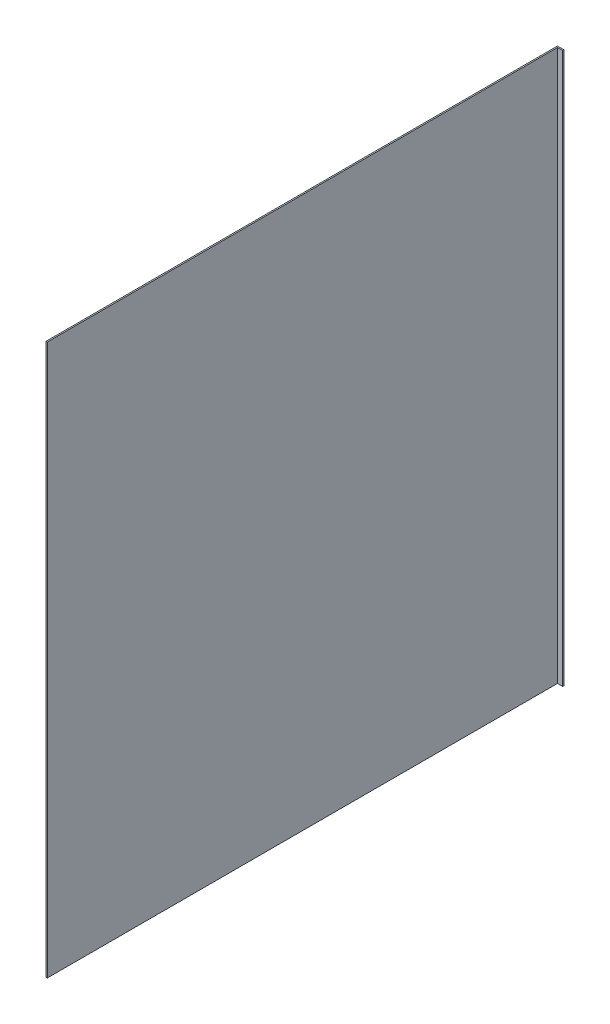
ISO-10303-21;
HEADER;
FILE_DESCRIPTION(('STEP AP214'),'2;1');
FILE_NAME('part.step','',(''),(''),'','','');
FILE_SCHEMA(('AUTOMOTIVE_DESIGN { 1 0 10303 214 1 1 1 1 }'));
ENDSEC;
DATA;
#1=APPLICATION_CONTEXT('core data for automotive mechanical design processes');
#2=APPLICATION_PROTOCOL_DEFINITION('international standard','automotive_design',2000,#1);
#3=PRODUCT_CONTEXT('',#1,'mechanical');
#4=PRODUCT('Part','Part','',(#3));
#5=PRODUCT_RELATED_PRODUCT_CATEGORY('part','',(#4));
#6=PRODUCT_DEFINITION_FORMATION('','',#4);
#7=PRODUCT_DEFINITION_CONTEXT('part definition',#1,'design');
#8=PRODUCT_DEFINITION('design','',#6,#7);
#9=PRODUCT_DEFINITION_SHAPE('','',#8);
#10=(LENGTH_UNIT() NAMED_UNIT(*) SI_UNIT(.MILLI.,.METRE.));
#11=(NAMED_UNIT(*) PLANE_ANGLE_UNIT() SI_UNIT($,.RADIAN.));
#12=(NAMED_UNIT(*) SI_UNIT($,.STERADIAN.) SOLID_ANGLE_UNIT());
#13=UNCERTAINTY_MEASURE_WITH_UNIT(LENGTH_MEASURE(1.E-05),#10,'distance_accuracy_value','');
#14=(GEOMETRIC_REPRESENTATION_CONTEXT(3) GLOBAL_UNCERTAINTY_ASSIGNED_CONTEXT((#13)) GLOBAL_UNIT_ASSIGNED_CONTEXT((#10,
#11,#12)) REPRESENTATION_CONTEXT('',''));
#15=CARTESIAN_POINT('',(0.,0.,0.));
#16=DIRECTION('',(0.,0.,1.));
#17=DIRECTION('',(1.,0.,0.));
#18=AXIS2_PLACEMENT_3D('',#15,#16,#17);
#19=CARTESIAN_POINT('',(140.,1880.,-20.));
#20=DIRECTION('',(1.,0.,0.));
#21=DIRECTION('',(0.,0.,-1.));
#22=AXIS2_PLACEMENT_3D('',#19,#20,#21);
#23=PLANE('',#22);
#24=DIRECTION('',(0.,0.,1.));
#25=VECTOR('',#24,1.);
#26=CARTESIAN_POINT('',(140.,1040.,-20.));
#27=LINE('',#26,#25);
#28=CARTESIAN_POINT('',(140.,1040.,-800.));
#29=VERTEX_POINT('',#28);
#30=CARTESIAN_POINT('',(140.,1040.,-20.));
#31=VERTEX_POINT('',#30);
#32=EDGE_CURVE('E123',#29,#31,#27,.T.);
#33=ORIENTED_EDGE('',*,*,#32,.T.);
#34=DIRECTION('',(0.,-1.,0.));
#35=VECTOR('',#34,1.);
#36=CARTESIAN_POINT('',(140.,1880.,-20.));
#37=LINE('',#36,#35);
#38=CARTESIAN_POINT('',(140.,1880.,-20.));
#39=VERTEX_POINT('',#38);
#40=EDGE_CURVE('E11',#39,#31,#37,.T.);
#41=ORIENTED_EDGE('',*,*,#40,.F.);
#42=DIRECTION('',(0.,0.,1.));
#43=VECTOR('',#42,1.);
#44=CARTESIAN_POINT('',(140.,1880.,-20.));
#45=LINE('',#44,#43);
#46=CARTESIAN_POINT('',(140.,1880.,-800.));
#47=VERTEX_POINT('',#46);
#48=EDGE_CURVE('E133',#47,#39,#45,.T.);
#49=ORIENTED_EDGE('',*,*,#48,.F.);
#50=DIRECTION('',(0.,-1.,0.));
#51=VECTOR('',#50,1.);
#52=CARTESIAN_POINT('',(140.,1880.,-800.));
#53=LINE('',#52,#51);
#54=EDGE_CURVE('E119',#47,#29,#53,.T.);
#55=ORIENTED_EDGE('',*,*,#54,.T.);
#56=EDGE_LOOP('',(#33,#41,#49,#55));
#57=FACE_BOUND('',#56,.T.);
#58=ADVANCED_FACE('F39',(#57),#23,.F.);
#59=CARTESIAN_POINT('',(142.,1880.,-20.));
#60=DIRECTION('',(0.,0.,-1.));
#61=DIRECTION('',(-1.,0.,0.));
#62=AXIS2_PLACEMENT_3D('',#59,#60,#61);
#63=PLANE('',#62);
#64=DIRECTION('',(1.,0.,0.));
#65=VECTOR('',#64,1.);
#66=CARTESIAN_POINT('',(142.,1040.,-20.));
#67=LINE('',#66,#65);
#68=CARTESIAN_POINT('',(142.,1040.,-20.));
#69=VERTEX_POINT('',#68);
#70=EDGE_CURVE('E126',#31,#69,#67,.T.);
#71=ORIENTED_EDGE('',*,*,#70,.T.);
#72=DIRECTION('',(0.,-1.,0.));
#73=VECTOR('',#72,1.);
#74=CARTESIAN_POINT('',(142.,1880.,-20.));
#75=LINE('',#74,#73);
#76=CARTESIAN_POINT('',(142.,1880.,-20.));
#77=VERTEX_POINT('',#76);
#78=EDGE_CURVE('E47',#77,#69,#75,.T.);
#79=ORIENTED_EDGE('',*,*,#78,.F.);
#80=DIRECTION('',(1.,0.,0.));
#81=VECTOR('',#80,1.);
#82=CARTESIAN_POINT('',(142.,1880.,-20.));
#83=LINE('',#82,#81);
#84=EDGE_CURVE('E92',#39,#77,#83,.T.);
#85=ORIENTED_EDGE('',*,*,#84,.F.);
#86=ORIENTED_EDGE('',*,*,#40,.T.);
#87=EDGE_LOOP('',(#71,#79,#85,#86));
#88=FACE_BOUND('',#87,.T.);
#89=ADVANCED_FACE('F157',(#88),#63,.F.);
#90=CARTESIAN_POINT('',(142.,1880.,-798.));
#91=DIRECTION('',(-1.,0.,0.));
#92=DIRECTION('',(0.,0.,1.));
#93=AXIS2_PLACEMENT_3D('',#90,#91,#92);
#94=PLANE('',#93);
#95=DIRECTION('',(0.,0.,-1.));
#96=VECTOR('',#95,1.);
#97=CARTESIAN_POINT('',(142.,1040.,-798.));
#98=LINE('',#97,#96);
#99=CARTESIAN_POINT('',(142.,1040.,-798.));
#100=VERTEX_POINT('',#99);
#101=EDGE_CURVE('E128',#69,#100,#98,.T.);
#102=ORIENTED_EDGE('',*,*,#101,.T.);
#103=DIRECTION('',(0.,-1.,0.));
#104=VECTOR('',#103,1.);
#105=CARTESIAN_POINT('',(142.,1880.,-798.));
#106=LINE('',#105,#104);
#107=CARTESIAN_POINT('',(142.,1880.,-798.));
#108=VERTEX_POINT('',#107);
#109=EDGE_CURVE('E114',#108,#100,#106,.T.);
#110=ORIENTED_EDGE('',*,*,#109,.F.);
#111=DIRECTION('',(0.,0.,-1.));
#112=VECTOR('',#111,1.);
#113=CARTESIAN_POINT('',(142.,1880.,-798.));
#114=LINE('',#113,#112);
#115=EDGE_CURVE('E105',#77,#108,#114,.T.);
#116=ORIENTED_EDGE('',*,*,#115,.F.);
#117=ORIENTED_EDGE('',*,*,#78,.T.);
#118=EDGE_LOOP('',(#102,#110,#116,#117));
#119=FACE_BOUND('',#118,.T.);
#120=ADVANCED_FACE('F139',(#119),#94,.F.);
#121=CARTESIAN_POINT('',(150.,1880.,-798.));
#122=DIRECTION('',(0.,0.,-1.));
#123=DIRECTION('',(-1.,0.,0.));
#124=AXIS2_PLACEMENT_3D('',#121,#122,#123);
#125=PLANE('',#124);
#126=DIRECTION('',(1.,0.,0.));
#127=VECTOR('',#126,1.);
#128=CARTESIAN_POINT('',(150.,1040.,-798.));
#129=LINE('',#128,#127);
#130=CARTESIAN_POINT('',(150.,1040.,-798.));
#131=VERTEX_POINT('',#130);
#132=EDGE_CURVE('E113',#100,#131,#129,.T.);
#133=ORIENTED_EDGE('',*,*,#132,.T.);
#134=DIRECTION('',(0.,-1.,0.));
#135=VECTOR('',#134,1.);
#136=CARTESIAN_POINT('',(150.,1880.,-798.));
#137=LINE('',#136,#135);
#138=CARTESIAN_POINT('',(150.,1880.,-798.));
#139=VERTEX_POINT('',#138);
#140=EDGE_CURVE('E110',#139,#131,#137,.T.);
#141=ORIENTED_EDGE('',*,*,#140,.F.);
#142=DIRECTION('',(1.,0.,0.));
#143=VECTOR('',#142,1.);
#144=CARTESIAN_POINT('',(150.,1880.,-798.));
#145=LINE('',#144,#143);
#146=EDGE_CURVE('E99',#108,#139,#145,.T.);
#147=ORIENTED_EDGE('',*,*,#146,.F.);
#148=ORIENTED_EDGE('',*,*,#109,.T.);
#149=EDGE_LOOP('',(#133,#141,#147,#148));
#150=FACE_BOUND('',#149,.T.);
#151=ADVANCED_FACE('F111',(#150),#125,.F.);
#152=CARTESIAN_POINT('',(150.,1880.,-800.));
#153=DIRECTION('',(-1.,0.,0.));
#154=DIRECTION('',(0.,0.,1.));
#155=AXIS2_PLACEMENT_3D('',#152,#153,#154);
#156=PLANE('',#155);
#157=DIRECTION('',(0.,0.,-1.));
#158=VECTOR('',#157,1.);
#159=CARTESIAN_POINT('',(150.,1040.,-800.));
#160=LINE('',#159,#158);
#161=CARTESIAN_POINT('',(150.,1040.,-800.));
#162=VERTEX_POINT('',#161);
#163=EDGE_CURVE('E78',#131,#162,#160,.T.);
#164=ORIENTED_EDGE('',*,*,#163,.T.);
#165=DIRECTION('',(0.,-1.,0.));
#166=VECTOR('',#165,1.);
#167=CARTESIAN_POINT('',(150.,1880.,-800.));
#168=LINE('',#167,#166);
#169=CARTESIAN_POINT('',(150.,1880.,-800.));
#170=VERTEX_POINT('',#169);
#171=EDGE_CURVE('E115',#170,#162,#168,.T.);
#172=ORIENTED_EDGE('',*,*,#171,.F.);
#173=DIRECTION('',(0.,0.,-1.));
#174=VECTOR('',#173,1.);
#175=CARTESIAN_POINT('',(150.,1880.,-800.));
#176=LINE('',#175,#174);
#177=EDGE_CURVE('E103',#139,#170,#176,.T.);
#178=ORIENTED_EDGE('',*,*,#177,.F.);
#179=ORIENTED_EDGE('',*,*,#140,.T.);
#180=EDGE_LOOP('',(#164,#172,#178,#179));
#181=FACE_BOUND('',#180,.T.);
#182=ADVANCED_FACE('F117',(#181),#156,.F.);
#183=CARTESIAN_POINT('',(140.,1880.,-800.));
#184=DIRECTION('',(0.,0.,1.));
#185=DIRECTION('',(1.,0.,0.));
#186=AXIS2_PLACEMENT_3D('',#183,#184,#185);
#187=PLANE('',#186);
#188=DIRECTION('',(-1.,0.,0.));
#189=VECTOR('',#188,1.);
#190=CARTESIAN_POINT('',(140.,1040.,-800.));
#191=LINE('',#190,#189);
#192=EDGE_CURVE('E84',#162,#29,#191,.T.);
#193=ORIENTED_EDGE('',*,*,#192,.T.);
#194=ORIENTED_EDGE('',*,*,#54,.F.);
#195=DIRECTION('',(-1.,0.,0.));
#196=VECTOR('',#195,1.);
#197=CARTESIAN_POINT('',(140.,1880.,-800.));
#198=LINE('',#197,#196);
#199=EDGE_CURVE('E55',#170,#47,#198,.T.);
#200=ORIENTED_EDGE('',*,*,#199,.F.);
#201=ORIENTED_EDGE('',*,*,#171,.T.);
#202=EDGE_LOOP('',(#193,#194,#200,#201));
#203=FACE_BOUND('',#202,.T.);
#204=ADVANCED_FACE('F146',(#203),#187,.F.);
#205=CARTESIAN_POINT('',(0.,1880.,0.));
#206=DIRECTION('',(0.,-1.,0.));
#207=DIRECTION('',(0.,0.,-1.));
#208=AXIS2_PLACEMENT_3D('',#205,#206,#207);
#209=PLANE('',#208);
#210=ORIENTED_EDGE('',*,*,#48,.T.);
#211=ORIENTED_EDGE('',*,*,#84,.T.);
#212=ORIENTED_EDGE('',*,*,#115,.T.);
#213=ORIENTED_EDGE('',*,*,#146,.T.);
#214=ORIENTED_EDGE('',*,*,#177,.T.);
#215=ORIENTED_EDGE('',*,*,#199,.T.);
#216=EDGE_LOOP('',(#210,#211,#212,#213,#214,#215));
#217=FACE_BOUND('',#216,.T.);
#218=ADVANCED_FACE('F101',(#217),#209,.F.);
#219=CARTESIAN_POINT('',(0.,1040.,0.));
#220=DIRECTION('',(0.,-1.,0.));
#221=DIRECTION('',(0.,0.,-1.));
#222=AXIS2_PLACEMENT_3D('',#219,#220,#221);
#223=PLANE('',#222);
#224=ORIENTED_EDGE('',*,*,#32,.F.);
#225=ORIENTED_EDGE('',*,*,#192,.F.);
#226=ORIENTED_EDGE('',*,*,#163,.F.);
#227=ORIENTED_EDGE('',*,*,#132,.F.);
#228=ORIENTED_EDGE('',*,*,#101,.F.);
#229=ORIENTED_EDGE('',*,*,#70,.F.);
#230=EDGE_LOOP('',(#224,#225,#226,#227,#228,#229));
#231=FACE_BOUND('',#230,.T.);
#232=ADVANCED_FACE('F142',(#231),#223,.T.);
#233=CLOSED_SHELL('',(#58,#89,#120,#151,#182,#204,#218,#232));
#234=MANIFOLD_SOLID_BREP('B2',#233);
#235=ADVANCED_BREP_SHAPE_REPRESENTATION('',(#18,#234),#14);
#236=SHAPE_DEFINITION_REPRESENTATION(#9,#235);
ENDSEC;
END-ISO-10303-21;
